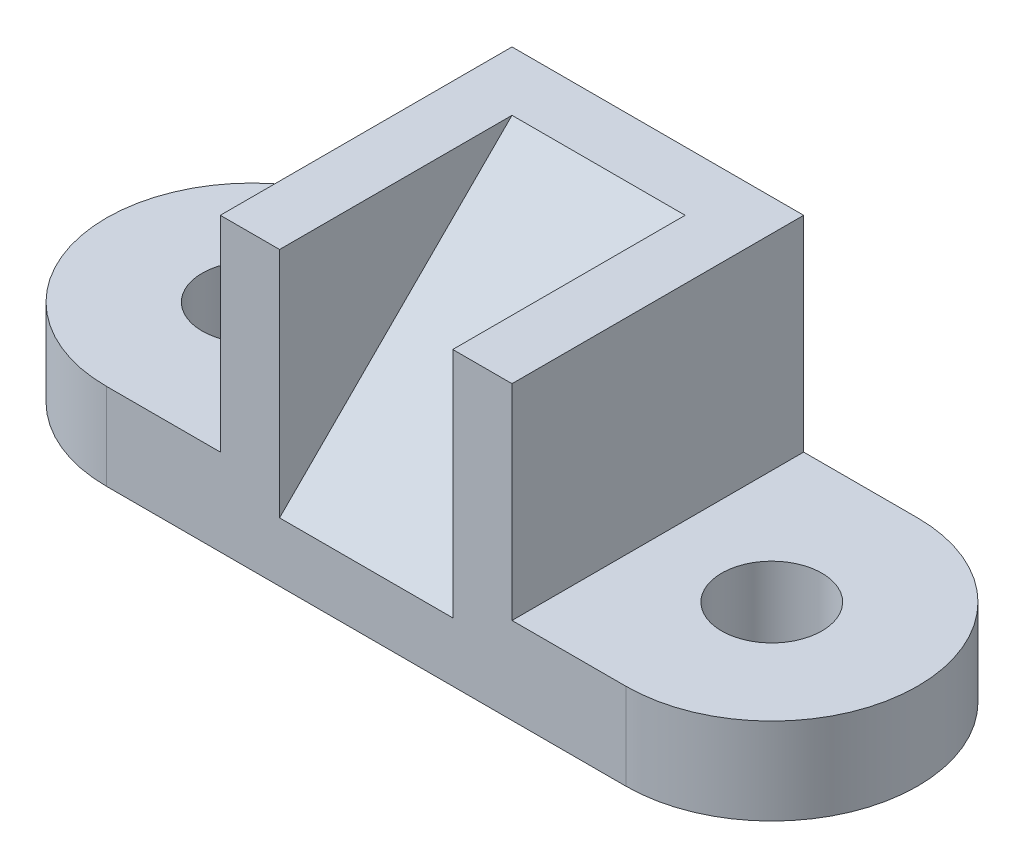
ISO-10303-21;
HEADER;
FILE_DESCRIPTION(('STEP AP214'),'2;1');
FILE_NAME('part.step','',(''),(''),'','','');
FILE_SCHEMA(('AUTOMOTIVE_DESIGN { 1 0 10303 214 1 1 1 1 }'));
ENDSEC;
DATA;
#1=APPLICATION_CONTEXT('core data for automotive mechanical design processes');
#2=APPLICATION_PROTOCOL_DEFINITION('international standard','automotive_design',2000,#1);
#3=PRODUCT_CONTEXT('',#1,'mechanical');
#4=PRODUCT('Part','Part','',(#3));
#5=PRODUCT_RELATED_PRODUCT_CATEGORY('part','',(#4));
#6=PRODUCT_DEFINITION_FORMATION('','',#4);
#7=PRODUCT_DEFINITION_CONTEXT('part definition',#1,'design');
#8=PRODUCT_DEFINITION('design','',#6,#7);
#9=PRODUCT_DEFINITION_SHAPE('','',#8);
#10=(LENGTH_UNIT() NAMED_UNIT(*) SI_UNIT(.MILLI.,.METRE.));
#11=(NAMED_UNIT(*) PLANE_ANGLE_UNIT() SI_UNIT($,.RADIAN.));
#12=(NAMED_UNIT(*) SI_UNIT($,.STERADIAN.) SOLID_ANGLE_UNIT());
#13=UNCERTAINTY_MEASURE_WITH_UNIT(LENGTH_MEASURE(1.E-05),#10,'distance_accuracy_value','');
#14=(GEOMETRIC_REPRESENTATION_CONTEXT(3) GLOBAL_UNCERTAINTY_ASSIGNED_CONTEXT((#13)) GLOBAL_UNIT_ASSIGNED_CONTEXT((#10,
#11,#12)) REPRESENTATION_CONTEXT('',''));
#15=CARTESIAN_POINT('',(0.,0.,0.));
#16=DIRECTION('',(0.,0.,1.));
#17=DIRECTION('',(1.,0.,0.));
#18=AXIS2_PLACEMENT_3D('',#15,#16,#17);
#19=CARTESIAN_POINT('',(-19.,64.,32.000012));
#20=DIRECTION('',(1.,0.,0.));
#21=DIRECTION('',(0.,1.,0.));
#22=AXIS2_PLACEMENT_3D('',#19,#20,#21);
#23=PLANE('',#22);
#24=DIRECTION('',(0.,-1.,0.));
#25=VECTOR('',#24,1.);
#26=CARTESIAN_POINT('',(-19.,19.,32.));
#27=LINE('',#26,#25);
#28=CARTESIAN_POINT('',(-19.,64.,32.));
#29=VERTEX_POINT('',#28);
#30=CARTESIAN_POINT('',(-19.,13.,32.));
#31=VERTEX_POINT('',#30);
#32=EDGE_CURVE('E126',#29,#31,#27,.T.);
#33=ORIENTED_EDGE('',*,*,#32,.T.);
#34=DIRECTION('',(0.,-0.707106781186548,0.707106781186547));
#35=VECTOR('',#34,1.);
#36=CARTESIAN_POINT('',(-19.,13.,32.));
#37=LINE('',#36,#35);
#38=CARTESIAN_POINT('',(-19.,64.,-19.));
#39=VERTEX_POINT('',#38);
#40=EDGE_CURVE('E125',#39,#31,#37,.T.);
#41=ORIENTED_EDGE('',*,*,#40,.F.);
#42=DIRECTION('',(0.,0.,-1.));
#43=VECTOR('',#42,1.);
#44=CARTESIAN_POINT('',(-19.,64.,0.));
#45=LINE('',#44,#43);
#46=EDGE_CURVE('E41',#29,#39,#45,.T.);
#47=ORIENTED_EDGE('',*,*,#46,.F.);
#48=EDGE_LOOP('',(#33,#41,#47));
#49=FACE_BOUND('',#48,.T.);
#50=ADVANCED_FACE('F33',(#49),#23,.T.);
#51=CARTESIAN_POINT('',(19.,64.,32.000012));
#52=DIRECTION('',(-1.,0.,0.));
#53=DIRECTION('',(0.,-1.,0.));
#54=AXIS2_PLACEMENT_3D('',#51,#52,#53);
#55=PLANE('',#54);
#56=DIRECTION('',(0.,0.,1.));
#57=VECTOR('',#56,1.);
#58=CARTESIAN_POINT('',(19.,64.,0.));
#59=LINE('',#58,#57);
#60=CARTESIAN_POINT('',(19.,64.,-19.));
#61=VERTEX_POINT('',#60);
#62=CARTESIAN_POINT('',(19.,64.,32.));
#63=VERTEX_POINT('',#62);
#64=EDGE_CURVE('E48',#61,#63,#59,.T.);
#65=ORIENTED_EDGE('',*,*,#64,.F.);
#66=DIRECTION('',(0.,-0.707106781186548,0.707106781186547));
#67=VECTOR('',#66,1.);
#68=CARTESIAN_POINT('',(19.,38.499994,6.500006));
#69=LINE('',#68,#67);
#70=CARTESIAN_POINT('',(19.,13.,32.));
#71=VERTEX_POINT('',#70);
#72=EDGE_CURVE('E129',#61,#71,#69,.T.);
#73=ORIENTED_EDGE('',*,*,#72,.T.);
#74=DIRECTION('',(0.,1.,0.));
#75=VECTOR('',#74,1.);
#76=CARTESIAN_POINT('',(19.,19.,32.));
#77=LINE('',#76,#75);
#78=EDGE_CURVE('E132',#71,#63,#77,.T.);
#79=ORIENTED_EDGE('',*,*,#78,.T.);
#80=EDGE_LOOP('',(#65,#73,#79));
#81=FACE_BOUND('',#80,.T.);
#82=ADVANCED_FACE('F264',(#81),#55,.T.);
#83=CARTESIAN_POINT('',(-57.,19.,32.));
#84=DIRECTION('',(0.,0.,-1.));
#85=DIRECTION('',(-1.,0.,0.));
#86=AXIS2_PLACEMENT_3D('',#83,#84,#85);
#87=PLANE('',#86);
#88=ORIENTED_EDGE('',*,*,#78,.F.);
#89=DIRECTION('',(1.,0.,0.));
#90=VECTOR('',#89,1.);
#91=CARTESIAN_POINT('',(-57.,13.,32.));
#92=LINE('',#91,#90);
#93=EDGE_CURVE('E11',#31,#71,#92,.T.);
#94=ORIENTED_EDGE('',*,*,#93,.F.);
#95=ORIENTED_EDGE('',*,*,#32,.F.);
#96=DIRECTION('',(1.,0.,0.));
#97=VECTOR('',#96,1.);
#98=CARTESIAN_POINT('',(-32.,64.,32.));
#99=LINE('',#98,#97);
#100=CARTESIAN_POINT('',(-32.,64.,32.));
#101=VERTEX_POINT('',#100);
#102=EDGE_CURVE('E121',#101,#29,#99,.T.);
#103=ORIENTED_EDGE('',*,*,#102,.F.);
#104=DIRECTION('',(0.,-1.,0.));
#105=VECTOR('',#104,1.);
#106=CARTESIAN_POINT('',(-32.,64.,32.));
#107=LINE('',#106,#105);
#108=CARTESIAN_POINT('',(-32.,19.,32.));
#109=VERTEX_POINT('',#108);
#110=EDGE_CURVE('E152',#101,#109,#107,.T.);
#111=ORIENTED_EDGE('',*,*,#110,.T.);
#112=DIRECTION('',(1.,0.,0.));
#113=VECTOR('',#112,1.);
#114=CARTESIAN_POINT('',(-57.,19.,32.));
#115=LINE('',#114,#113);
#116=CARTESIAN_POINT('',(-57.,19.,32.));
#117=VERTEX_POINT('',#116);
#118=EDGE_CURVE('E179',#117,#109,#115,.T.);
#119=ORIENTED_EDGE('',*,*,#118,.F.);
#120=DIRECTION('',(0.,-1.,0.));
#121=VECTOR('',#120,1.);
#122=CARTESIAN_POINT('',(-57.,19.,32.));
#123=LINE('',#122,#121);
#124=CARTESIAN_POINT('',(-57.,0.,32.));
#125=VERTEX_POINT('',#124);
#126=EDGE_CURVE('E203',#117,#125,#123,.T.);
#127=ORIENTED_EDGE('',*,*,#126,.T.);
#128=DIRECTION('',(1.,0.,0.));
#129=VECTOR('',#128,1.);
#130=CARTESIAN_POINT('',(-57.,0.,32.));
#131=LINE('',#130,#129);
#132=CARTESIAN_POINT('',(57.,0.,32.));
#133=VERTEX_POINT('',#132);
#134=EDGE_CURVE('E190',#125,#133,#131,.T.);
#135=ORIENTED_EDGE('',*,*,#134,.T.);
#136=DIRECTION('',(0.,-1.,0.));
#137=VECTOR('',#136,1.);
#138=CARTESIAN_POINT('',(57.,19.,32.));
#139=LINE('',#138,#137);
#140=CARTESIAN_POINT('',(57.,19.,32.));
#141=VERTEX_POINT('',#140);
#142=EDGE_CURVE('E200',#141,#133,#139,.T.);
#143=ORIENTED_EDGE('',*,*,#142,.F.);
#144=CARTESIAN_POINT('',(32.,19.,32.));
#145=VERTEX_POINT('',#144);
#146=EDGE_CURVE('E177',#145,#141,#115,.T.);
#147=ORIENTED_EDGE('',*,*,#146,.F.);
#148=DIRECTION('',(0.,-1.,0.));
#149=VECTOR('',#148,1.);
#150=CARTESIAN_POINT('',(32.,64.,32.));
#151=LINE('',#150,#149);
#152=CARTESIAN_POINT('',(32.,64.,32.));
#153=VERTEX_POINT('',#152);
#154=EDGE_CURVE('E147',#153,#145,#151,.T.);
#155=ORIENTED_EDGE('',*,*,#154,.F.);
#156=EDGE_CURVE('E145',#63,#153,#99,.T.);
#157=ORIENTED_EDGE('',*,*,#156,.F.);
#158=EDGE_LOOP('',(#88,#94,#95,#103,#111,#119,#127,#135,#143,#147,#155,#157));
#159=FACE_BOUND('',#158,.T.);
#160=ADVANCED_FACE('F210',(#159),#87,.F.);
#161=CARTESIAN_POINT('',(0.,64.,0.));
#162=DIRECTION('',(0.,1.,0.));
#163=DIRECTION('',(0.,0.,1.));
#164=AXIS2_PLACEMENT_3D('',#161,#162,#163);
#165=PLANE('',#164);
#166=DIRECTION('',(-1.,0.,0.));
#167=VECTOR('',#166,1.);
#168=CARTESIAN_POINT('',(-19.,64.,-19.));
#169=LINE('',#168,#167);
#170=EDGE_CURVE('E118',#61,#39,#169,.T.);
#171=ORIENTED_EDGE('',*,*,#170,.F.);
#172=ORIENTED_EDGE('',*,*,#64,.T.);
#173=ORIENTED_EDGE('',*,*,#156,.T.);
#174=DIRECTION('',(0.,0.,-1.));
#175=VECTOR('',#174,1.);
#176=CARTESIAN_POINT('',(32.,64.,-32.));
#177=LINE('',#176,#175);
#178=CARTESIAN_POINT('',(32.,64.,-32.));
#179=VERTEX_POINT('',#178);
#180=EDGE_CURVE('E139',#153,#179,#177,.T.);
#181=ORIENTED_EDGE('',*,*,#180,.T.);
#182=DIRECTION('',(-1.,0.,0.));
#183=VECTOR('',#182,1.);
#184=CARTESIAN_POINT('',(-32.,64.,-32.));
#185=LINE('',#184,#183);
#186=CARTESIAN_POINT('',(-32.,64.,-32.));
#187=VERTEX_POINT('',#186);
#188=EDGE_CURVE('E141',#179,#187,#185,.T.);
#189=ORIENTED_EDGE('',*,*,#188,.T.);
#190=DIRECTION('',(0.,0.,1.));
#191=VECTOR('',#190,1.);
#192=CARTESIAN_POINT('',(-32.,64.,-32.));
#193=LINE('',#192,#191);
#194=EDGE_CURVE('E143',#187,#101,#193,.T.);
#195=ORIENTED_EDGE('',*,*,#194,.T.);
#196=ORIENTED_EDGE('',*,*,#102,.T.);
#197=ORIENTED_EDGE('',*,*,#46,.T.);
#198=EDGE_LOOP('',(#171,#172,#173,#181,#189,#195,#196,#197));
#199=FACE_BOUND('',#198,.T.);
#200=ADVANCED_FACE('F116',(#199),#165,.T.);
#201=CARTESIAN_POINT('',(-57.,19.,0.));
#202=DIRECTION('',(0.,1.,0.));
#203=DIRECTION('',(0.,0.,1.));
#204=AXIS2_PLACEMENT_3D('',#201,#202,#203);
#205=PLANE('',#204);
#206=DIRECTION('',(0.,0.,-1.));
#207=VECTOR('',#206,1.);
#208=CARTESIAN_POINT('',(32.,19.,-32.));
#209=LINE('',#208,#207);
#210=CARTESIAN_POINT('',(32.,19.,-32.));
#211=VERTEX_POINT('',#210);
#212=EDGE_CURVE('E138',#145,#211,#209,.T.);
#213=ORIENTED_EDGE('',*,*,#212,.F.);
#214=ORIENTED_EDGE('',*,*,#146,.T.);
#215=CARTESIAN_POINT('',(57.,19.,0.));
#216=DIRECTION('',(0.,1.,0.));
#217=DIRECTION('',(0.,0.,1.));
#218=AXIS2_PLACEMENT_3D('',#215,#216,#217);
#219=CIRCLE('',#218,32.);
#220=CARTESIAN_POINT('',(57.,19.,-32.));
#221=VERTEX_POINT('',#220);
#222=EDGE_CURVE('E181',#141,#221,#219,.T.);
#223=ORIENTED_EDGE('',*,*,#222,.T.);
#224=DIRECTION('',(-1.,0.,0.));
#225=VECTOR('',#224,1.);
#226=CARTESIAN_POINT('',(-57.,19.,-32.));
#227=LINE('',#226,#225);
#228=EDGE_CURVE('E184',#221,#211,#227,.T.);
#229=ORIENTED_EDGE('',*,*,#228,.T.);
#230=EDGE_LOOP('',(#213,#214,#223,#229));
#231=FACE_BOUND('',#230,.T.);
#232=CARTESIAN_POINT('',(57.,19.,0.));
#233=DIRECTION('',(0.,1.,0.));
#234=DIRECTION('',(0.,0.,1.));
#235=AXIS2_PLACEMENT_3D('',#232,#233,#234);
#236=CIRCLE('',#235,11.);
#237=CARTESIAN_POINT('',(57.,19.,11.));
#238=VERTEX_POINT('',#237);
#239=EDGE_CURVE('E162',#238,#238,#236,.T.);
#240=ORIENTED_EDGE('',*,*,#239,.F.);
#241=EDGE_LOOP('',(#240));
#242=FACE_BOUND('',#241,.T.);
#243=ADVANCED_FACE('F243',(#231,#242),#205,.T.);
#244=DIRECTION('',(0.,0.,1.));
#245=VECTOR('',#244,1.);
#246=CARTESIAN_POINT('',(-32.,19.,-32.));
#247=LINE('',#246,#245);
#248=CARTESIAN_POINT('',(-32.,19.,-32.));
#249=VERTEX_POINT('',#248);
#250=EDGE_CURVE('E56',#249,#109,#247,.T.);
#251=ORIENTED_EDGE('',*,*,#250,.F.);
#252=CARTESIAN_POINT('',(-57.,19.,-32.));
#253=VERTEX_POINT('',#252);
#254=EDGE_CURVE('E183',#249,#253,#227,.T.);
#255=ORIENTED_EDGE('',*,*,#254,.T.);
#256=CARTESIAN_POINT('',(-57.,19.,0.));
#257=DIRECTION('',(0.,1.,0.));
#258=DIRECTION('',(0.,0.,1.));
#259=AXIS2_PLACEMENT_3D('',#256,#257,#258);
#260=CIRCLE('',#259,32.);
#261=EDGE_CURVE('E174',#253,#117,#260,.T.);
#262=ORIENTED_EDGE('',*,*,#261,.T.);
#263=ORIENTED_EDGE('',*,*,#118,.T.);
#264=EDGE_LOOP('',(#251,#255,#262,#263));
#265=FACE_BOUND('',#264,.T.);
#266=CARTESIAN_POINT('',(-57.,19.,0.));
#267=DIRECTION('',(0.,1.,0.));
#268=DIRECTION('',(0.,0.,1.));
#269=AXIS2_PLACEMENT_3D('',#266,#267,#268);
#270=CIRCLE('',#269,11.);
#271=CARTESIAN_POINT('',(-57.,19.,11.));
#272=VERTEX_POINT('',#271);
#273=EDGE_CURVE('E168',#272,#272,#270,.T.);
#274=ORIENTED_EDGE('',*,*,#273,.F.);
#275=EDGE_LOOP('',(#274));
#276=FACE_BOUND('',#275,.T.);
#277=ADVANCED_FACE('F229',(#265,#276),#205,.T.);
#278=CARTESIAN_POINT('',(-57.,0.,0.));
#279=DIRECTION('',(0.,1.,0.));
#280=DIRECTION('',(0.,0.,1.));
#281=AXIS2_PLACEMENT_3D('',#278,#279,#280);
#282=PLANE('',#281);
#283=CARTESIAN_POINT('',(-57.,0.,0.));
#284=DIRECTION('',(0.,1.,0.));
#285=DIRECTION('',(0.,0.,1.));
#286=AXIS2_PLACEMENT_3D('',#283,#284,#285);
#287=CIRCLE('',#286,32.);
#288=CARTESIAN_POINT('',(-57.,0.,-32.));
#289=VERTEX_POINT('',#288);
#290=EDGE_CURVE('E171',#289,#125,#287,.T.);
#291=ORIENTED_EDGE('',*,*,#290,.F.);
#292=DIRECTION('',(-1.,0.,0.));
#293=VECTOR('',#292,1.);
#294=CARTESIAN_POINT('',(-57.,0.,-32.));
#295=LINE('',#294,#293);
#296=CARTESIAN_POINT('',(57.,0.,-32.));
#297=VERTEX_POINT('',#296);
#298=EDGE_CURVE('E178',#297,#289,#295,.T.);
#299=ORIENTED_EDGE('',*,*,#298,.F.);
#300=CARTESIAN_POINT('',(57.,0.,0.));
#301=DIRECTION('',(0.,1.,0.));
#302=DIRECTION('',(0.,0.,1.));
#303=AXIS2_PLACEMENT_3D('',#300,#301,#302);
#304=CIRCLE('',#303,32.);
#305=EDGE_CURVE('E192',#133,#297,#304,.T.);
#306=ORIENTED_EDGE('',*,*,#305,.F.);
#307=ORIENTED_EDGE('',*,*,#134,.F.);
#308=EDGE_LOOP('',(#291,#299,#306,#307));
#309=FACE_BOUND('',#308,.T.);
#310=CARTESIAN_POINT('',(-57.,0.,0.));
#311=DIRECTION('',(0.,1.,0.));
#312=DIRECTION('',(0.,0.,1.));
#313=AXIS2_PLACEMENT_3D('',#310,#311,#312);
#314=CIRCLE('',#313,11.);
#315=CARTESIAN_POINT('',(-57.,0.,11.));
#316=VERTEX_POINT('',#315);
#317=EDGE_CURVE('E165',#316,#316,#314,.T.);
#318=ORIENTED_EDGE('',*,*,#317,.T.);
#319=EDGE_LOOP('',(#318));
#320=FACE_BOUND('',#319,.T.);
#321=CARTESIAN_POINT('',(57.,0.,0.));
#322=DIRECTION('',(0.,1.,0.));
#323=DIRECTION('',(0.,0.,1.));
#324=AXIS2_PLACEMENT_3D('',#321,#322,#323);
#325=CIRCLE('',#324,11.);
#326=CARTESIAN_POINT('',(57.,0.,11.));
#327=VERTEX_POINT('',#326);
#328=EDGE_CURVE('E161',#327,#327,#325,.T.);
#329=ORIENTED_EDGE('',*,*,#328,.T.);
#330=EDGE_LOOP('',(#329));
#331=FACE_BOUND('',#330,.T.);
#332=ADVANCED_FACE('F235',(#309,#320,#331),#282,.F.);
#333=CARTESIAN_POINT('',(-57.,19.,0.));
#334=DIRECTION('',(0.,-1.,0.));
#335=DIRECTION('',(0.,0.,-1.));
#336=AXIS2_PLACEMENT_3D('',#333,#334,#335);
#337=CYLINDRICAL_SURFACE('',#336,32.);
#338=ORIENTED_EDGE('',*,*,#290,.T.);
#339=ORIENTED_EDGE('',*,*,#126,.F.);
#340=ORIENTED_EDGE('',*,*,#261,.F.);
#341=DIRECTION('',(0.,-1.,0.));
#342=VECTOR('',#341,1.);
#343=CARTESIAN_POINT('',(-57.,19.,-32.));
#344=LINE('',#343,#342);
#345=EDGE_CURVE('E187',#253,#289,#344,.T.);
#346=ORIENTED_EDGE('',*,*,#345,.T.);
#347=EDGE_LOOP('',(#338,#339,#340,#346));
#348=FACE_BOUND('',#347,.T.);
#349=ADVANCED_FACE('F35',(#348),#337,.T.);
#350=CARTESIAN_POINT('',(57.,19.,0.));
#351=DIRECTION('',(0.,-1.,0.));
#352=DIRECTION('',(0.,0.,-1.));
#353=AXIS2_PLACEMENT_3D('',#350,#351,#352);
#354=CYLINDRICAL_SURFACE('',#353,32.);
#355=ORIENTED_EDGE('',*,*,#305,.T.);
#356=DIRECTION('',(0.,-1.,0.));
#357=VECTOR('',#356,1.);
#358=CARTESIAN_POINT('',(57.,19.,-32.));
#359=LINE('',#358,#357);
#360=EDGE_CURVE('E197',#221,#297,#359,.T.);
#361=ORIENTED_EDGE('',*,*,#360,.F.);
#362=ORIENTED_EDGE('',*,*,#222,.F.);
#363=ORIENTED_EDGE('',*,*,#142,.T.);
#364=EDGE_LOOP('',(#355,#361,#362,#363));
#365=FACE_BOUND('',#364,.T.);
#366=ADVANCED_FACE('F240',(#365),#354,.T.);
#367=CARTESIAN_POINT('',(-57.,19.,-32.));
#368=DIRECTION('',(0.,0.,1.));
#369=DIRECTION('',(1.,0.,0.));
#370=AXIS2_PLACEMENT_3D('',#367,#368,#369);
#371=PLANE('',#370);
#372=ORIENTED_EDGE('',*,*,#298,.T.);
#373=ORIENTED_EDGE('',*,*,#345,.F.);
#374=ORIENTED_EDGE('',*,*,#254,.F.);
#375=DIRECTION('',(0.,-1.,0.));
#376=VECTOR('',#375,1.);
#377=CARTESIAN_POINT('',(-32.,64.,-32.));
#378=LINE('',#377,#376);
#379=EDGE_CURVE('E155',#187,#249,#378,.T.);
#380=ORIENTED_EDGE('',*,*,#379,.F.);
#381=ORIENTED_EDGE('',*,*,#188,.F.);
#382=DIRECTION('',(0.,-1.,0.));
#383=VECTOR('',#382,1.);
#384=CARTESIAN_POINT('',(32.,64.,-32.));
#385=LINE('',#384,#383);
#386=EDGE_CURVE('E158',#179,#211,#385,.T.);
#387=ORIENTED_EDGE('',*,*,#386,.T.);
#388=ORIENTED_EDGE('',*,*,#228,.F.);
#389=ORIENTED_EDGE('',*,*,#360,.T.);
#390=EDGE_LOOP('',(#372,#373,#374,#380,#381,#387,#388,#389));
#391=FACE_BOUND('',#390,.T.);
#392=ADVANCED_FACE('F220',(#391),#371,.F.);
#393=CARTESIAN_POINT('',(-57.,19.,0.));
#394=DIRECTION('',(0.,-1.,0.));
#395=DIRECTION('',(0.,0.,-1.));
#396=AXIS2_PLACEMENT_3D('',#393,#394,#395);
#397=CYLINDRICAL_SURFACE('',#396,11.);
#398=ORIENTED_EDGE('',*,*,#273,.T.);
#399=EDGE_LOOP('',(#398));
#400=FACE_BOUND('',#399,.T.);
#401=ORIENTED_EDGE('',*,*,#317,.F.);
#402=EDGE_LOOP('',(#401));
#403=FACE_BOUND('',#402,.T.);
#404=ADVANCED_FACE('F252',(#400,#403),#397,.F.);
#405=CARTESIAN_POINT('',(57.,19.,0.));
#406=DIRECTION('',(0.,-1.,0.));
#407=DIRECTION('',(0.,0.,-1.));
#408=AXIS2_PLACEMENT_3D('',#405,#406,#407);
#409=CYLINDRICAL_SURFACE('',#408,11.);
#410=ORIENTED_EDGE('',*,*,#239,.T.);
#411=EDGE_LOOP('',(#410));
#412=FACE_BOUND('',#411,.T.);
#413=ORIENTED_EDGE('',*,*,#328,.F.);
#414=EDGE_LOOP('',(#413));
#415=FACE_BOUND('',#414,.T.);
#416=ADVANCED_FACE('F249',(#412,#415),#409,.F.);
#417=CARTESIAN_POINT('',(32.,64.,-32.));
#418=DIRECTION('',(-1.,0.,0.));
#419=DIRECTION('',(0.,0.,1.));
#420=AXIS2_PLACEMENT_3D('',#417,#418,#419);
#421=PLANE('',#420);
#422=ORIENTED_EDGE('',*,*,#212,.T.);
#423=ORIENTED_EDGE('',*,*,#386,.F.);
#424=ORIENTED_EDGE('',*,*,#180,.F.);
#425=ORIENTED_EDGE('',*,*,#154,.T.);
#426=EDGE_LOOP('',(#422,#423,#424,#425));
#427=FACE_BOUND('',#426,.T.);
#428=ADVANCED_FACE('F216',(#427),#421,.F.);
#429=CARTESIAN_POINT('',(-32.,64.,-32.));
#430=DIRECTION('',(1.,0.,0.));
#431=DIRECTION('',(0.,0.,-1.));
#432=AXIS2_PLACEMENT_3D('',#429,#430,#431);
#433=PLANE('',#432);
#434=ORIENTED_EDGE('',*,*,#250,.T.);
#435=ORIENTED_EDGE('',*,*,#110,.F.);
#436=ORIENTED_EDGE('',*,*,#194,.F.);
#437=ORIENTED_EDGE('',*,*,#379,.T.);
#438=EDGE_LOOP('',(#434,#435,#436,#437));
#439=FACE_BOUND('',#438,.T.);
#440=ADVANCED_FACE('F226',(#439),#433,.F.);
#441=CARTESIAN_POINT('',(32.,13.,32.));
#442=DIRECTION('',(0.,-0.707106781186547,-0.707106781186548));
#443=DIRECTION('',(0.,0.707106781186548,-0.707106781186547));
#444=AXIS2_PLACEMENT_3D('',#441,#442,#443);
#445=PLANE('',#444);
#446=ORIENTED_EDGE('',*,*,#72,.F.);
#447=ORIENTED_EDGE('',*,*,#170,.T.);
#448=ORIENTED_EDGE('',*,*,#40,.T.);
#449=ORIENTED_EDGE('',*,*,#93,.T.);
#450=EDGE_LOOP('',(#446,#447,#448,#449));
#451=FACE_BOUND('',#450,.T.);
#452=ADVANCED_FACE('F131',(#451),#445,.F.);
#453=CLOSED_SHELL('',(#50,#82,#160,#200,#243,#277,#332,#349,#366,#392,#404,#416,#428,#440,#452));
#454=MANIFOLD_SOLID_BREP('B2',#453);
#455=ADVANCED_BREP_SHAPE_REPRESENTATION('',(#18,#454),#14);
#456=SHAPE_DEFINITION_REPRESENTATION(#9,#455);
ENDSEC;
END-ISO-10303-21;
